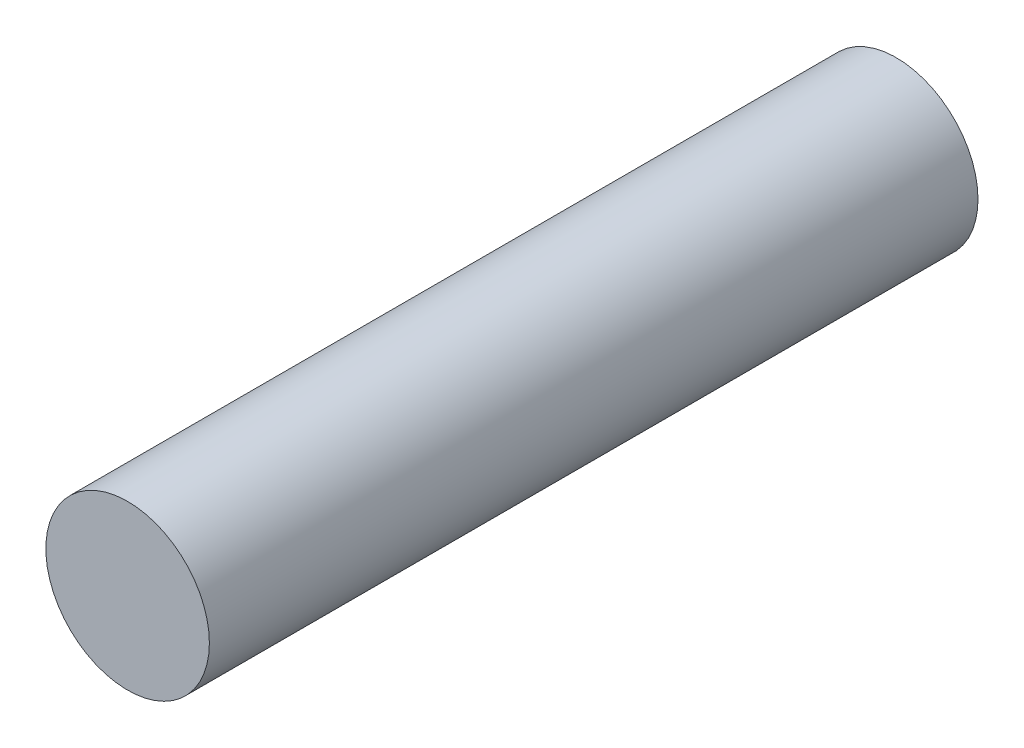
ISO-10303-21;
HEADER;
FILE_DESCRIPTION(('STEP AP214'),'2;1');
FILE_NAME('part.step','',(''),(''),'','','');
FILE_SCHEMA(('AUTOMOTIVE_DESIGN { 1 0 10303 214 1 1 1 1 }'));
ENDSEC;
DATA;
#1=APPLICATION_CONTEXT('core data for automotive mechanical design processes');
#2=APPLICATION_PROTOCOL_DEFINITION('international standard','automotive_design',2000,#1);
#3=PRODUCT_CONTEXT('',#1,'mechanical');
#4=PRODUCT('Part','Part','',(#3));
#5=PRODUCT_RELATED_PRODUCT_CATEGORY('part','',(#4));
#6=PRODUCT_DEFINITION_FORMATION('','',#4);
#7=PRODUCT_DEFINITION_CONTEXT('part definition',#1,'design');
#8=PRODUCT_DEFINITION('design','',#6,#7);
#9=PRODUCT_DEFINITION_SHAPE('','',#8);
#10=(LENGTH_UNIT() NAMED_UNIT(*) SI_UNIT(.MILLI.,.METRE.));
#11=(NAMED_UNIT(*) PLANE_ANGLE_UNIT() SI_UNIT($,.RADIAN.));
#12=(NAMED_UNIT(*) SI_UNIT($,.STERADIAN.) SOLID_ANGLE_UNIT());
#13=UNCERTAINTY_MEASURE_WITH_UNIT(LENGTH_MEASURE(1.E-05),#10,'distance_accuracy_value','');
#14=(GEOMETRIC_REPRESENTATION_CONTEXT(3) GLOBAL_UNCERTAINTY_ASSIGNED_CONTEXT((#13)) GLOBAL_UNIT_ASSIGNED_CONTEXT((#10,
#11,#12)) REPRESENTATION_CONTEXT('',''));
#15=CARTESIAN_POINT('',(0.,0.,0.));
#16=DIRECTION('',(0.,0.,1.));
#17=DIRECTION('',(1.,0.,0.));
#18=AXIS2_PLACEMENT_3D('',#15,#16,#17);
#19=CARTESIAN_POINT('',(0.,0.,47.));
#20=DIRECTION('',(0.,0.,-1.));
#21=DIRECTION('',(-1.,0.,0.));
#22=AXIS2_PLACEMENT_3D('',#19,#20,#21);
#23=CYLINDRICAL_SURFACE('',#22,5.);
#24=CARTESIAN_POINT('',(0.,0.,47.));
#25=DIRECTION('',(0.,0.,1.));
#26=DIRECTION('',(1.,0.,0.));
#27=AXIS2_PLACEMENT_3D('',#24,#25,#26);
#28=CIRCLE('',#27,5.);
#29=CARTESIAN_POINT('',(5.,0.,47.));
#30=VERTEX_POINT('',#29);
#31=EDGE_CURVE('E10',#30,#30,#28,.T.);
#32=ORIENTED_EDGE('',*,*,#31,.F.);
#33=EDGE_LOOP('',(#32));
#34=FACE_BOUND('',#33,.T.);
#35=CARTESIAN_POINT('',(0.,0.,0.));
#36=DIRECTION('',(0.,0.,1.));
#37=DIRECTION('',(1.,0.,0.));
#38=AXIS2_PLACEMENT_3D('',#35,#36,#37);
#39=CIRCLE('',#38,5.);
#40=CARTESIAN_POINT('',(5.,0.,0.));
#41=VERTEX_POINT('',#40);
#42=EDGE_CURVE('E36',#41,#41,#39,.T.);
#43=ORIENTED_EDGE('',*,*,#42,.T.);
#44=EDGE_LOOP('',(#43));
#45=FACE_BOUND('',#44,.T.);
#46=ADVANCED_FACE('F33',(#34,#45),#23,.T.);
#47=CARTESIAN_POINT('',(0.,0.,47.));
#48=DIRECTION('',(0.,0.,1.));
#49=DIRECTION('',(1.,0.,0.));
#50=AXIS2_PLACEMENT_3D('',#47,#48,#49);
#51=PLANE('',#50);
#52=ORIENTED_EDGE('',*,*,#31,.T.);
#53=EDGE_LOOP('',(#52));
#54=FACE_BOUND('',#53,.T.);
#55=ADVANCED_FACE('F48',(#54),#51,.T.);
#56=CARTESIAN_POINT('',(0.,0.,0.));
#57=DIRECTION('',(0.,0.,1.));
#58=DIRECTION('',(1.,0.,0.));
#59=AXIS2_PLACEMENT_3D('',#56,#57,#58);
#60=PLANE('',#59);
#61=ORIENTED_EDGE('',*,*,#42,.F.);
#62=EDGE_LOOP('',(#61));
#63=FACE_BOUND('',#62,.T.);
#64=ADVANCED_FACE('F46',(#63),#60,.F.);
#65=CLOSED_SHELL('',(#46,#55,#64));
#66=MANIFOLD_SOLID_BREP('B2',#65);
#67=ADVANCED_BREP_SHAPE_REPRESENTATION('',(#18,#66),#14);
#68=SHAPE_DEFINITION_REPRESENTATION(#9,#67);
ENDSEC;
END-ISO-10303-21;
